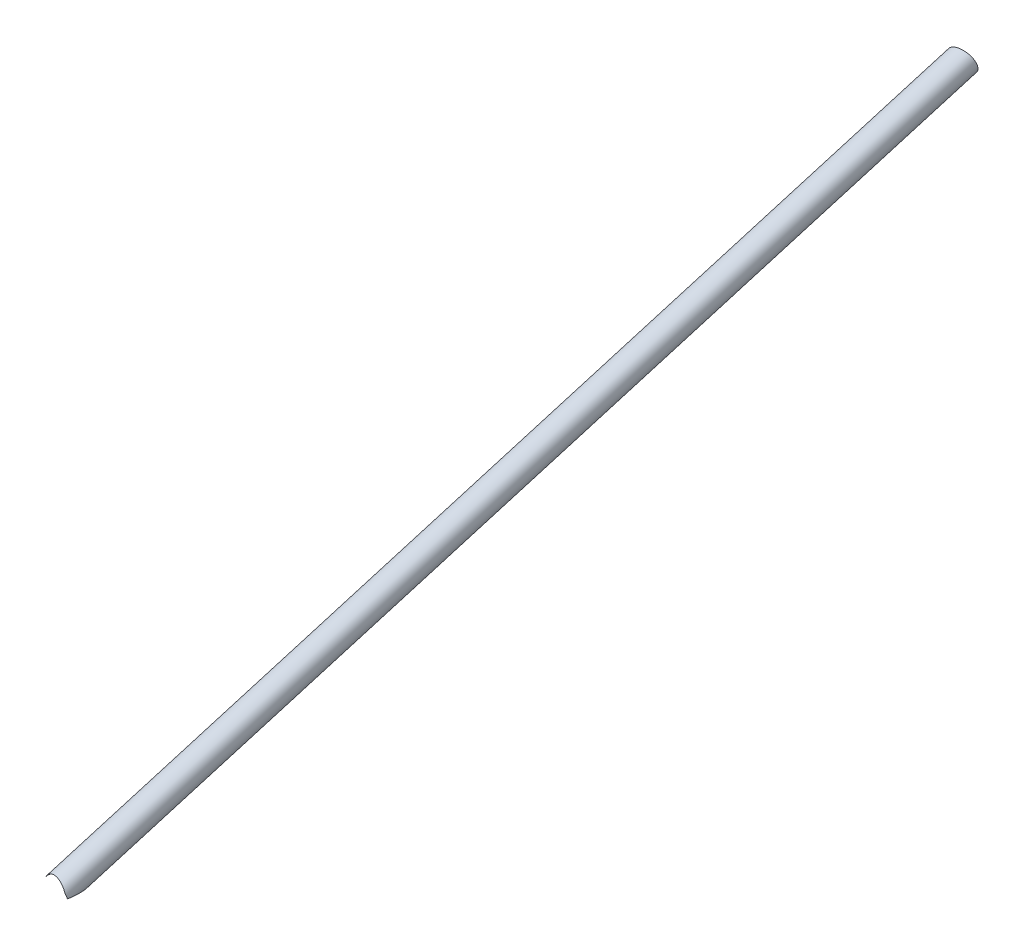
ISO-10303-21;
HEADER;
FILE_DESCRIPTION(('STEP AP214'),'2;1');
FILE_NAME('part.step','',(''),(''),'','','');
FILE_SCHEMA(('AUTOMOTIVE_DESIGN { 1 0 10303 214 1 1 1 1 }'));
ENDSEC;
DATA;
#1=APPLICATION_CONTEXT('core data for automotive mechanical design processes');
#2=APPLICATION_PROTOCOL_DEFINITION('international standard','automotive_design',2000,#1);
#3=PRODUCT_CONTEXT('',#1,'mechanical');
#4=PRODUCT('Part','Part','',(#3));
#5=PRODUCT_RELATED_PRODUCT_CATEGORY('part','',(#4));
#6=PRODUCT_DEFINITION_FORMATION('','',#4);
#7=PRODUCT_DEFINITION_CONTEXT('part definition',#1,'design');
#8=PRODUCT_DEFINITION('design','',#6,#7);
#9=PRODUCT_DEFINITION_SHAPE('','',#8);
#10=(LENGTH_UNIT() NAMED_UNIT(*) SI_UNIT(.MILLI.,.METRE.));
#11=(NAMED_UNIT(*) PLANE_ANGLE_UNIT() SI_UNIT($,.RADIAN.));
#12=(NAMED_UNIT(*) SI_UNIT($,.STERADIAN.) SOLID_ANGLE_UNIT());
#13=UNCERTAINTY_MEASURE_WITH_UNIT(LENGTH_MEASURE(1.E-05),#10,'distance_accuracy_value','');
#14=(GEOMETRIC_REPRESENTATION_CONTEXT(3) GLOBAL_UNCERTAINTY_ASSIGNED_CONTEXT((#13)) GLOBAL_UNIT_ASSIGNED_CONTEXT((#10,
#11,#12)) REPRESENTATION_CONTEXT('',''));
#15=CARTESIAN_POINT('',(0.,0.,0.));
#16=DIRECTION('',(0.,0.,1.));
#17=DIRECTION('',(1.,0.,0.));
#18=AXIS2_PLACEMENT_3D('',#15,#16,#17);
#19=CARTESIAN_POINT('',(-150.,500.,-1140.));
#20=DIRECTION('',(-0.0991899501072693,-0.396759800429077,0.912547540986877));
#21=DIRECTION('',(0.,-0.917070056253235,-0.39872611141445));
#22=AXIS2_PLACEMENT_3D('',#19,#20,#21);
#23=CYLINDRICAL_SURFACE('',#22,9.39999999999998);
#24=CARTESIAN_POINT('',(-148.870462108792,504.518151564833,-1150.39174859912));
#25=DIRECTION('',(-0.139628686010803,0.296710957772957,-0.944704418101425));
#26=DIRECTION('',(-0.904818702200995,-0.425797036329879,0.));
#27=AXIS2_PLACEMENT_3D('',#24,#25,#26);
#28=ELLIPSE('',#27,9.73124262715105,9.39999999999998);
#29=CARTESIAN_POINT('',(-157.675472433494,500.374617294385,-1150.39174859912));
#30=VERTEX_POINT('',#29);
#31=EDGE_CURVE('E107',#30,#30,#28,.T.);
#32=ORIENTED_EDGE('',*,*,#31,.T.);
#33=EDGE_LOOP('',(#32));
#34=FACE_BOUND('',#33,.T.);
#35=CARTESIAN_POINT('',(-220.064661909304,211.120893834007,-499.153135881706));
#36=CARTESIAN_POINT('',(-219.96082944293,210.969621935667,-498.805215018113));
#37=CARTESIAN_POINT('',(-219.861401801638,210.820763185261,-498.454922366743));
#38=CARTESIAN_POINT('',(-219.669911680091,210.527227931772,-497.750580735431));
#39=CARTESIAN_POINT('',(-219.577849788321,210.382551763444,-497.396531457907));
#40=CARTESIAN_POINT('',(-219.399998297891,210.096868440503,-496.685276886422));
#41=CARTESIAN_POINT('',(-219.314210423698,209.955862301437,-496.328070754785));
#42=CARTESIAN_POINT('',(-219.148102895325,209.67718888091,-495.61108945489));
#43=CARTESIAN_POINT('',(-219.067783407543,209.539521701131,-495.251314208823));
#44=CARTESIAN_POINT('',(-218.833831264763,209.130780783011,-494.167928817747));
#45=CARTESIAN_POINT('',(-218.687395291621,208.864277087637,-493.441034597602));
#46=CARTESIAN_POINT('',(-218.409746658629,208.341814271487,-491.980579186831));
#47=CARTESIAN_POINT('',(-218.278534884912,208.085855765058,-491.247017610804));
#48=CARTESIAN_POINT('',(-218.090597806271,207.70808932579,-490.139611325409));
#49=CARTESIAN_POINT('',(-218.029200520187,207.582697778848,-489.767769405641));
#50=CARTESIAN_POINT('',(-217.909320098101,207.334286459914,-489.022842792879));
#51=CARTESIAN_POINT('',(-217.850836844672,207.211266592472,-488.64975815061));
#52=CARTESIAN_POINT('',(-217.679369398335,206.845653363118,-487.528729783794));
#53=CARTESIAN_POINT('',(-217.570372973566,206.606517416624,-486.77904404042));
#54=CARTESIAN_POINT('',(-217.361488485521,206.137578015812,-485.276485617178));
#55=CARTESIAN_POINT('',(-217.261589948058,205.907764002921,-484.523617673646));
#56=CARTESIAN_POINT('',(-217.069418165177,205.457370898319,-483.014173744783));
#57=CARTESIAN_POINT('',(-216.977144764104,205.236791618142,-482.257597835478));
#58=CARTESIAN_POINT('',(-216.799277112594,204.805976416339,-480.742807782751));
#59=CARTESIAN_POINT('',(-216.713666653823,204.595715885413,-479.984602539675));
#60=CARTESIAN_POINT('',(-216.547803817039,204.185962661731,-478.464665763676));
#61=CARTESIAN_POINT('',(-216.467551659211,203.986470411532,-477.702934087217));
#62=CARTESIAN_POINT('',(-216.311204365483,203.59947616567,-476.174142492695));
#63=CARTESIAN_POINT('',(-216.23511907925,203.412002414979,-475.407074404776));
#64=CARTESIAN_POINT('',(-216.08625772242,203.052107572373,-473.869163351397));
#65=CARTESIAN_POINT('',(-216.013481243603,202.879684621156,-473.098320864666));
#66=CARTESIAN_POINT('',(-215.906275037471,202.636082414801,-471.94224410546));
#67=CARTESIAN_POINT('',(-215.871016693918,202.557698891732,-471.558601039787));
#68=CARTESIAN_POINT('',(-215.80090012685,202.406338728497,-470.790216100798));
#69=CARTESIAN_POINT('',(-215.766041895608,202.333361983764,-470.405474248882));
#70=CARTESIAN_POINT('',(-215.696567630002,202.193640266377,-469.634604845763));
#71=CARTESIAN_POINT('',(-215.661951745579,202.126898882143,-469.248476627826));
#72=CARTESIAN_POINT('',(-215.592852834671,202.000815895249,-468.475001967521));
#73=CARTESIAN_POINT('',(-215.558369805454,201.941474139647,-468.087655550501));
#74=CARTESIAN_POINT('',(-215.489556145688,201.83183594197,-467.313134358168));
#75=CARTESIAN_POINT('',(-215.455225423748,201.781506810131,-466.92596426136));
#76=CARTESIAN_POINT('',(-215.386527089375,201.691481572309,-466.150331966893));
#77=CARTESIAN_POINT('',(-215.352159473597,201.651786529688,-465.761869643947));
#78=CARTESIAN_POINT('',(-215.283471034226,201.585521423804,-464.984213376193));
#79=CARTESIAN_POINT('',(-215.249150199317,201.558937662302,-464.595020623218));
#80=CARTESIAN_POINT('',(-215.180753355595,201.522055493106,-463.815876889823));
#81=CARTESIAN_POINT('',(-215.146677277403,201.511752273121,-463.425926167585));
#82=CARTESIAN_POINT('',(-215.098531912781,201.5117193361,-462.867928637116));
#83=CARTESIAN_POINT('',(-215.084113886297,201.513617842544,-462.699900294433));
#84=CARTESIAN_POINT('',(-215.055523394219,201.521656339396,-462.363913865341));
#85=CARTESIAN_POINT('',(-215.041350935864,201.527796454637,-462.195955781145));
#86=CARTESIAN_POINT('',(-215.013355299397,201.544775158173,-461.860176782189));
#87=CARTESIAN_POINT('',(-214.999532256242,201.555615533396,-461.69235594394));
#88=CARTESIAN_POINT('',(-214.97239236311,201.582500784651,-461.357093030097));
#89=CARTESIAN_POINT('',(-214.959075519862,201.598545729831,-461.189650959564));
#90=CARTESIAN_POINT('',(-214.920247873764,201.655160005968,-460.689403575298));
#91=CARTESIAN_POINT('',(-214.895752535553,201.704264549474,-460.35741662395));
#92=CARTESIAN_POINT('',(-214.85166850565,201.829970240812,-459.698362111302));
#93=CARTESIAN_POINT('',(-214.832076983314,201.906555463473,-459.371291814917));
#94=CARTESIAN_POINT('',(-214.8063351988,202.060956921665,-458.833103321834));
#95=CARTESIAN_POINT('',(-214.797881838283,202.129916155263,-458.619553196466));
#96=CARTESIAN_POINT('',(-214.786037918811,202.283104182157,-458.197885308637));
#97=CARTESIAN_POINT('',(-214.782645581866,202.367327601314,-457.989765663649));
#98=CARTESIAN_POINT('',(-214.782473132653,202.551531145224,-457.580679324623));
#99=CARTESIAN_POINT('',(-214.785690334293,202.651504853875,-457.379709758588));
#100=CARTESIAN_POINT('',(-214.800414711216,202.867013483819,-456.98657955664));
#101=CARTESIAN_POINT('',(-214.811921853037,202.982548342299,-456.794418885174));
#102=CARTESIAN_POINT('',(-214.844973381277,203.228810776946,-456.419450359774));
#103=CARTESIAN_POINT('',(-214.866573056302,203.359619024577,-456.236700259236));
#104=CARTESIAN_POINT('',(-214.921321595915,203.634062287765,-455.882930575646));
#105=CARTESIAN_POINT('',(-214.954470818859,203.777697701219,-455.711911356774));
#106=CARTESIAN_POINT('',(-215.033522426805,204.075491779698,-455.382215877625));
#107=CARTESIAN_POINT('',(-215.079434630329,204.229658477261,-455.223549240926));
#108=CARTESIAN_POINT('',(-215.184808308445,204.545723095889,-454.918946999038));
#109=CARTESIAN_POINT('',(-215.244269776858,204.707621013427,-454.77301138804));
#110=CARTESIAN_POINT('',(-215.372727424687,205.025406616735,-454.503091359236));
#111=CARTESIAN_POINT('',(-215.440818246386,205.180970578113,-454.378291369967));
#112=CARTESIAN_POINT('',(-215.589290308086,205.494366437123,-454.139343111471));
#113=CARTESIAN_POINT('',(-215.669670759541,205.652198188657,-454.025194159592));
#114=CARTESIAN_POINT('',(-215.842659990219,205.968240404357,-453.807128739071));
#115=CARTESIAN_POINT('',(-215.935269902983,206.126450902291,-453.703213220519));
#116=CARTESIAN_POINT('',(-216.132490399664,206.441531478268,-453.505195921966));
#117=CARTESIAN_POINT('',(-216.237101866339,206.598401456798,-453.411094864827));
#118=CARTESIAN_POINT('',(-216.470200096123,206.926472469926,-453.222421153415));
#119=CARTESIAN_POINT('',(-216.600047809247,207.097339978768,-453.128947069423));
#120=CARTESIAN_POINT('',(-216.87350754597,207.433712190717,-452.953148374518));
#121=CARTESIAN_POINT('',(-217.017120350925,207.59921658868,-452.870824397167));
#122=CARTESIAN_POINT('',(-217.317417876782,207.923325354883,-452.716942213368));
#123=CARTESIAN_POINT('',(-217.474106574103,208.081927601684,-452.645387300506));
#124=CARTESIAN_POINT('',(-217.799679362889,208.390807238189,-452.512822737132));
#125=CARTESIAN_POINT('',(-217.968563983405,208.541084266251,-452.451813544475));
#126=CARTESIAN_POINT('',(-218.330908069247,208.843223449085,-452.335948629291));
#127=CARTESIAN_POINT('',(-218.525259495738,208.994333384765,-452.281916359932));
#128=CARTESIAN_POINT('',(-218.925742226971,209.28427844637,-452.185879661577));
#129=CARTESIAN_POINT('',(-219.131874148643,209.423112928472,-452.143875863191));
#130=CARTESIAN_POINT('',(-219.554565433792,209.687483422111,-452.072007123649));
#131=CARTESIAN_POINT('',(-219.771126335479,209.813017463122,-452.042143979337));
#132=CARTESIAN_POINT('',(-220.21316027322,210.04993265257,-451.994819885171));
#133=CARTESIAN_POINT('',(-220.438633307832,210.161313803296,-451.97735893331));
#134=CARTESIAN_POINT('',(-220.901514066555,210.371398508351,-451.95501111472));
#135=CARTESIAN_POINT('',(-221.13907059339,210.469802191143,-451.950384082324));
#136=CARTESIAN_POINT('',(-221.620001292311,210.650820858827,-451.955020999209));
#137=CARTESIAN_POINT('',(-221.863375598401,210.733435479648,-451.964285268759));
#138=CARTESIAN_POINT('',(-222.354072929677,210.882735813747,-451.997448459337));
#139=CARTESIAN_POINT('',(-222.601397175277,210.949416498206,-452.021351992121));
#140=CARTESIAN_POINT('',(-223.097817269138,211.066938953308,-452.084703742165));
#141=CARTESIAN_POINT('',(-223.346913086137,211.117781002739,-452.124151685789));
#142=CARTESIAN_POINT('',(-223.841468757699,211.203539070544,-452.219059028102));
#143=CARTESIAN_POINT('',(-224.086934982219,211.238647110345,-452.2743110871));
#144=CARTESIAN_POINT('',(-224.574974156324,211.294667198745,-452.402166537644));
#145=CARTESIAN_POINT('',(-224.817547076714,211.315579104223,-452.474770104114));
#146=CARTESIAN_POINT('',(-225.296940480878,211.344419588381,-452.638455733445));
#147=CARTESIAN_POINT('',(-225.533766048249,211.352360085893,-452.729520746327));
#148=CARTESIAN_POINT('',(-225.999026922723,211.356995961471,-452.931279548466));
#149=CARTESIAN_POINT('',(-226.227463152901,211.353692580464,-453.04197117036));
#150=CARTESIAN_POINT('',(-226.656528967507,211.338630678069,-453.274859106098));
#151=CARTESIAN_POINT('',(-226.857967196533,211.327513106787,-453.395606706798));
#152=CARTESIAN_POINT('',(-227.248711450583,211.29963427726,-453.654788760885));
#153=CARTESIAN_POINT('',(-227.438018629829,211.282873556892,-453.793221527836));
#154=CARTESIAN_POINT('',(-227.802226836458,211.246041019215,-454.087171149494));
#155=CARTESIAN_POINT('',(-227.97714135759,211.22597235752,-454.242671675619));
#156=CARTESIAN_POINT('',(-228.311174131773,211.184836785461,-454.56966357416));
#157=CARTESIAN_POINT('',(-228.470293108817,211.163769920916,-454.741154212964));
#158=CARTESIAN_POINT('',(-228.755773682123,211.124918373328,-455.079150815596));
#159=CARTESIAN_POINT('',(-228.883818693126,211.107023568657,-455.244229921784));
#160=CARTESIAN_POINT('',(-229.126632302646,211.073291416692,-455.584032898464));
#161=CARTESIAN_POINT('',(-229.2414020102,211.057453897515,-455.758755961483));
#162=CARTESIAN_POINT('',(-229.458153580452,211.028688813224,-456.116209768541));
#163=CARTESIAN_POINT('',(-229.560132371399,211.015761946516,-456.298942421926));
#164=CARTESIAN_POINT('',(-229.752107296455,210.993344127014,-456.670796999958));
#165=CARTESIAN_POINT('',(-229.842101961881,210.983853595107,-456.859919704167));
#166=CARTESIAN_POINT('',(-230.004086817619,210.969186004325,-457.22714269366));
#167=CARTESIAN_POINT('',(-230.076952406773,210.963715405951,-457.404848237641));
#168=CARTESIAN_POINT('',(-230.214355540076,210.955885207276,-457.763540248354));
#169=CARTESIAN_POINT('',(-230.278891514365,210.953526192638,-457.94452732624));
#170=CARTESIAN_POINT('',(-230.400519853747,210.951840745065,-458.30911791177));
#171=CARTESIAN_POINT('',(-230.457607222133,210.952516337164,-458.492723085033));
#172=CARTESIAN_POINT('',(-230.565109870684,210.956756584407,-458.86184658256));
#173=CARTESIAN_POINT('',(-230.61552464359,210.96032145905,-459.047365051118));
#174=CARTESIAN_POINT('',(-230.710659132725,210.970178375721,-459.420744973122));
#175=CARTESIAN_POINT('',(-230.755349703929,210.976483707799,-459.608613455332));
#176=CARTESIAN_POINT('',(-230.839426098102,210.991617487848,-459.985427223775));
#177=CARTESIAN_POINT('',(-230.878811860188,211.000445964773,-460.17437252234));
#178=CARTESIAN_POINT('',(-230.952862535212,211.020411198731,-460.552967142491));
#179=CARTESIAN_POINT('',(-230.987529651388,211.031546872314,-460.742616092739));
#180=CARTESIAN_POINT('',(-231.052684446004,211.055925048351,-461.122484467732));
#181=CARTESIAN_POINT('',(-231.083172222995,211.06916750111,-461.312703878919));
#182=CARTESIAN_POINT('',(-231.16971035645,211.112078882961,-461.88823599223));
#183=CARTESIAN_POINT('',(-231.220030892352,211.144701019008,-462.274196079419));
#184=CARTESIAN_POINT('',(-231.308552457758,211.216328616948,-463.046937534212));
#185=CARTESIAN_POINT('',(-231.346751054926,211.255335357571,-463.433719050985));
#186=CARTESIAN_POINT('',(-231.413284094541,211.338564268604,-464.207815733878));
#187=CARTESIAN_POINT('',(-231.441611952809,211.382789893994,-464.595131083845));
#188=CARTESIAN_POINT('',(-231.490059798372,211.475455257765,-465.36977438217));
#189=CARTESIAN_POINT('',(-231.51017940152,211.523895193247,-465.75710233027));
#190=CARTESIAN_POINT('',(-231.543529201832,211.624311270585,-466.532603993837));
#191=CARTESIAN_POINT('',(-231.556741535322,211.676296192308,-466.920777320564));
#192=CARTESIAN_POINT('',(-231.577169464479,211.783029671613,-467.696899741673));
#193=CARTESIAN_POINT('',(-231.584384975849,211.837778268032,-468.084848832827));
#194=CARTESIAN_POINT('',(-231.598204131026,212.005275667185,-469.248001020696));
#195=CARTESIAN_POINT('',(-231.596992650752,212.121318012426,-470.022825511087));
#196=CARTESIAN_POINT('',(-231.577842536066,212.359132896026,-471.573663616341));
#197=CARTESIAN_POINT('',(-231.559854913132,212.480921224124,-472.349674065882));
#198=CARTESIAN_POINT('',(-231.509526872012,212.727482718987,-473.900813643268));
#199=CARTESIAN_POINT('',(-231.47718523022,212.852256139358,-474.67594269033));
#200=CARTESIAN_POINT('',(-231.399665835817,213.10270033768,-476.224181012791));
#201=CARTESIAN_POINT('',(-231.354507863806,213.228369444098,-476.997291562134));
#202=CARTESIAN_POINT('',(-231.252092819072,213.479267176833,-478.542756473975));
#203=CARTESIAN_POINT('',(-231.194836137048,213.604495817242,-479.315110860082));
#204=CARTESIAN_POINT('',(-231.081746006772,213.827032566615,-480.696750454011));
#205=CARTESIAN_POINT('',(-231.028146189664,213.924673227689,-481.306165911172));
#206=CARTESIAN_POINT('',(-230.913463395117,214.118235675262,-482.524565702473));
#207=CARTESIAN_POINT('',(-230.852380441967,214.214157467339,-483.133550038007));
#208=CARTESIAN_POINT('',(-230.722457894004,214.403709893967,-484.351378283394));
#209=CARTESIAN_POINT('',(-230.653614273724,214.497339308526,-484.960221954697));
#210=CARTESIAN_POINT('',(-230.507779288278,214.681597078576,-486.177387457783));
#211=CARTESIAN_POINT('',(-230.43078796695,214.772225450209,-486.785709292354));
#212=CARTESIAN_POINT('',(-230.268100322393,214.949682727632,-488.001268803383));
#213=CARTESIAN_POINT('',(-230.182410642822,215.036514461772,-488.608506952132));
#214=CARTESIAN_POINT('',(-230.001410899387,215.205596149337,-489.822184310026));
#215=CARTESIAN_POINT('',(-229.906100985831,215.287846174315,-490.428623531504));
#216=CARTESIAN_POINT('',(-229.704708297289,215.44668008617,-491.640160451869));
#217=CARTESIAN_POINT('',(-229.598630776111,215.523266705144,-492.2452586592));
#218=CARTESIAN_POINT('',(-229.373997607431,215.669457221611,-493.453953686459));
#219=CARTESIAN_POINT('',(-229.255442758708,215.73906156554,-494.05755059997));
#220=CARTESIAN_POINT('',(-229.002912746137,215.869765890845,-495.265390643486));
#221=CARTESIAN_POINT('',(-228.868869897929,215.930825751481,-495.869624225817));
#222=CARTESIAN_POINT('',(-228.65380281249,216.013703305415,-496.773661860216));
#223=CARTESIAN_POINT('',(-228.579751001399,216.039884917691,-497.074729500678));
#224=CARTESIAN_POINT('',(-228.426338899028,216.088843955923,-497.675788301148));
#225=CARTESIAN_POINT('',(-228.346978733754,216.111621462643,-497.975779486529));
#226=CARTESIAN_POINT('',(-228.182321810574,216.153126520624,-498.573753582403));
#227=CARTESIAN_POINT('',(-228.09703756198,216.171862282228,-498.871739349864));
#228=CARTESIAN_POINT('',(-227.919350813822,216.204546445273,-499.465841371497));
#229=CARTESIAN_POINT('',(-227.826948787167,216.218495164434,-499.76195774846));
#230=CARTESIAN_POINT('',(-227.633725957743,216.240511936213,-500.351318405693));
#231=CARTESIAN_POINT('',(-227.532914305004,216.24858628972,-500.644565429467));
#232=CARTESIAN_POINT('',(-227.320889721704,216.257365711324,-501.227352842718));
#233=CARTESIAN_POINT('',(-227.209680156181,216.258073155274,-501.516894397133));
#234=CARTESIAN_POINT('',(-227.021786093278,216.251501913253,-501.974177506649));
#235=CARTESIAN_POINT('',(-226.949378225248,216.247343989376,-502.143719206751));
#236=CARTESIAN_POINT('',(-226.799023665284,216.234915663983,-502.48024857086));
#237=CARTESIAN_POINT('',(-226.721075637135,216.226644267445,-502.647235606834));
#238=CARTESIAN_POINT('',(-226.55873793521,216.205098104257,-502.977408200065));
#239=CARTESIAN_POINT('',(-226.474359123204,216.191831631337,-503.140599585251));
#240=CARTESIAN_POINT('',(-226.297697552239,216.159051460111,-503.461955649908));
#241=CARTESIAN_POINT('',(-226.205419008421,216.139541078399,-503.620122949118));
#242=CARTESIAN_POINT('',(-226.00883692892,216.091978128795,-503.932802696494));
#243=CARTESIAN_POINT('',(-225.904303668266,216.063737475759,-504.087144632717));
#244=CARTESIAN_POINT('',(-225.682417446888,215.996186346344,-504.384095016771));
#245=CARTESIAN_POINT('',(-225.565066724586,215.956877800958,-504.52670550576));
#246=CARTESIAN_POINT('',(-225.345122602532,215.874813680748,-504.760272189955));
#247=CARTESIAN_POINT('',(-225.245832251777,215.835195311278,-504.855376142478));
#248=CARTESIAN_POINT('',(-225.037643833457,215.745646797275,-505.02880037414));
#249=CARTESIAN_POINT('',(-224.928768810851,215.695741019269,-505.107159437515));
#250=CARTESIAN_POINT('',(-224.730796506436,215.598405291063,-505.223246503769));
#251=CARTESIAN_POINT('',(-224.643582554952,215.553490451215,-505.26623576014));
#252=CARTESIAN_POINT('',(-224.466001659471,215.457495814896,-505.33559051179));
#253=CARTESIAN_POINT('',(-224.375638539711,215.406423322507,-505.361975476019));
#254=CARTESIAN_POINT('',(-224.194081325292,215.299140858272,-505.396308621963));
#255=CARTESIAN_POINT('',(-224.102885601366,215.242916736398,-505.404204339614));
#256=CARTESIAN_POINT('',(-223.922740701179,215.127336720177,-505.401723625866));
#257=CARTESIAN_POINT('',(-223.833793873258,215.067977737113,-505.391328834648));
#258=CARTESIAN_POINT('',(-223.636284836043,214.931456152404,-505.349372735922));
#259=CARTESIAN_POINT('',(-223.529093281393,214.853905992966,-505.312756658478));
#260=CARTESIAN_POINT('',(-223.323380879237,214.699363570495,-505.219572105393));
#261=CARTESIAN_POINT('',(-223.224879570695,214.622372904731,-505.162960031638));
#262=CARTESIAN_POINT('',(-223.048550923109,214.480049817827,-505.043541444323));
#263=CARTESIAN_POINT('',(-222.969694985342,214.41449326763,-504.98247249838));
#264=CARTESIAN_POINT('',(-222.817721639294,214.284971247408,-504.851986969071));
#265=CARTESIAN_POINT('',(-222.744609069755,214.22100714935,-504.782563469118));
#266=CARTESIAN_POINT('',(-222.603282868381,214.09458539652,-504.637164487529));
#267=CARTESIAN_POINT('',(-222.535083498436,214.032132451313,-504.561171237531));
#268=CARTESIAN_POINT('',(-222.403164754542,213.908868096844,-504.404236072563));
#269=CARTESIAN_POINT('',(-222.339443787334,213.84805610858,-504.323295936878));
#270=CARTESIAN_POINT('',(-222.181460702735,213.694493253794,-504.111317944994));
#271=CARTESIAN_POINT('',(-222.089940695972,213.602805272281,-503.97747156888));
#272=CARTESIAN_POINT('',(-221.914460130959,213.422574385448,-503.702838441379));
#273=CARTESIAN_POINT('',(-221.830503836617,213.334033270936,-503.562047843659));
#274=CARTESIAN_POINT('',(-221.668727648922,213.159562404089,-503.275006997695));
#275=CARTESIAN_POINT('',(-221.590919211823,213.07363770223,-503.128747271634));
#276=CARTESIAN_POINT('',(-221.440596147471,212.904209899963,-502.832147271306));
#277=CARTESIAN_POINT('',(-221.368082452104,212.820707227389,-502.681806285084));
#278=CARTESIAN_POINT('',(-221.156888424361,212.572932056917,-502.225104415136));
#279=CARTESIAN_POINT('',(-221.024990914873,212.411869049077,-501.913864509677));
#280=CARTESIAN_POINT('',(-220.774956157746,212.096725931094,-501.283027945664));
#281=CARTESIAN_POINT('',(-220.656805228238,211.942638972711,-500.963439990706));
#282=CARTESIAN_POINT('',(-220.458414218969,211.676482973967,-500.395619205697));
#283=CARTESIAN_POINT('',(-220.375895017725,211.563228783599,-500.148730349718));
#284=CARTESIAN_POINT('',(-220.256208565787,211.395630363212,-499.776512431228));
#285=CARTESIAN_POINT('',(-220.217046473084,211.340219743243,-499.652298722742));
#286=CARTESIAN_POINT('',(-220.139953509164,211.230066577191,-499.403204301104));
#287=CARTESIAN_POINT('',(-220.102022567123,211.175323992791,-499.278323626803));
#288=CARTESIAN_POINT('',(-220.064661909304,211.120893834007,-499.153135881706));
#289=B_SPLINE_CURVE_WITH_KNOTS('',3,(#35,#36,#37,#38,#39,#40,#41,#42,#43,#44,#45,#46,#47,#48,
#49,#50,#51,#52,#53,#54,#55,#56,#57,#58,#59,#60,#61,#62,#63,#64,#65,#66,#67,#68,#69,#70,#71,#72,
#73,#74,#75,#76,#77,#78,#79,#80,#81,#82,#83,#84,#85,#86,#87,#88,#89,#90,#91,#92,#93,#94,#95,#96,
#97,#98,#99,#100,#101,#102,#103,#104,#105,#106,#107,#108,#109,#110,#111,#112,#113,#114,#115,
#116,#117,#118,#119,#120,#121,#122,#123,#124,#125,#126,#127,#128,#129,#130,#131,#132,#133,#134,
#135,#136,#137,#138,#139,#140,#141,#142,#143,#144,#145,#146,#147,#148,#149,#150,#151,#152,#153,
#154,#155,#156,#157,#158,#159,#160,#161,#162,#163,#164,#165,#166,#167,#168,#169,#170,#171,#172,
#173,#174,#175,#176,#177,#178,#179,#180,#181,#182,#183,#184,#185,#186,#187,#188,#189,#190,#191,
#192,#193,#194,#195,#196,#197,#198,#199,#200,#201,#202,#203,#204,#205,#206,#207,#208,#209,#210,
#211,#212,#213,#214,#215,#216,#217,#218,#219,#220,#221,#222,#223,#224,#225,#226,#227,#228,#229,
#230,#231,#232,#233,#234,#235,#236,#237,#238,#239,#240,#241,#242,#243,#244,#245,#246,#247,#248,
#249,#250,#251,#252,#253,#254,#255,#256,#257,#258,#259,#260,#261,#262,#263,#264,#265,#266,#267,
#268,#269,#270,#271,#272,#273,#274,#275,#276,#277,#278,#279,#280,#281,#282,#283,#284,#285,#286,
#287,#288),.UNSPECIFIED.,.T.,.F.,(4,2,2,2,2,2,2,2,2,2,2,2,2,2,2,2,2,2,2,2,2,2,2,2,2,2,2,2,2,2,2,
2,2,2,2,2,2,2,2,2,2,2,2,2,2,2,2,2,2,2,2,2,2,2,2,2,2,2,2,2,2,2,2,2,2,2,2,2,2,2,2,2,2,2,2,2,2,2,2,
2,2,2,2,2,2,2,2,2,2,2,2,2,2,2,2,2,2,2,2,2,2,2,2,2,2,2,2,2,2,2,2,2,2,2,2,2,2,2,2,2,2,2,2,2,2,2,
4),(0.,1.17999676196415,2.36008770559703,3.54050179757393,4.72095179256761,7.0844199034725,
9.44802551234497,10.6395752572721,11.8310769470994,14.2141843543517,16.5945125137533,
18.9747920706909,21.3490875532907,23.723480541172,26.1032632414396,28.4827515380335,
29.6621792941726,30.841584234464,32.0216637891054,33.2017189488368,34.3774031748412,
35.5532049202864,36.7277756103599,37.9019990494803,38.4079255487566,38.9138669384228,
39.4200008440156,39.9261414743267,40.9346312963165,41.9425376354637,42.6156879664457,
43.2886017567895,43.9612421316916,44.6338797915424,45.3102462697242,45.9866337358932,
46.6635429917272,47.3404519388079,47.9720230882922,48.6035537309444,49.235142950895,
49.8667786563814,50.5682624315353,51.2697860490298,51.9715237848007,52.6732919796917,
53.4285491043412,54.1838458171761,54.9392542749031,55.6946626104184,56.4652569763174,
57.2358691087694,58.0067241294021,58.7775655808793,59.5387246852617,60.299891463359,
61.0603584460532,61.8207415027362,62.5250959509945,63.2293832828771,63.9330026070167,
64.6365896656479,65.2649634619175,65.8932847250054,66.5217565922776,67.1503054095459,
67.726477486138,68.3027579942914,68.8794231194394,69.4561320581007,70.0356695529358,
70.6152136983342,71.1944863066637,71.773745252914,72.9451767202774,74.1168430935764,
75.2892895257778,76.4617908222295,77.637309641098,78.8128449839498,81.1629576327393,
83.5199544757241,85.8771522791856,88.2307316080343,90.5842349454595,92.4427240342277,
94.3012070905729,96.1606586190659,98.0201001440332,99.8781319955315,101.73613482117,
103.593235395148,105.450217152755,107.315645109615,108.249026702109,109.182386146282,
110.1138313408,111.0452147027,111.975597577097,112.905680390506,113.458776284969,
114.012006034731,114.564321234233,115.116343544541,115.681202245955,116.245962458599,
116.674026611228,117.101088276575,117.421100778446,117.740737355025,118.061279821371,
118.382144228412,118.791663833441,119.20208189983,119.559627035412,119.917470239359,
120.276313493817,120.635028431422,121.193407054589,121.752098509375,122.311807641857,
122.871615048141,123.994307654868,125.115873118023,125.967432259329,126.392039297162,
126.816621865526),.UNSPECIFIED.);
#290=CARTESIAN_POINT('',(-214.860041456087,203.313279484268,-456.305286136041));
#291=VERTEX_POINT('',#290);
#292=CARTESIAN_POINT('',(-215.191128345141,201.52898822881,-463.933703285774));
#293=VERTEX_POINT('',#292);
#294=EDGE_CURVE('E98',#291,#293,#289,.T.);
#295=ORIENTED_EDGE('',*,*,#294,.T.);
#296=CARTESIAN_POINT('',(-222.869770330287,199.900460150074,-473.346138408661));
#297=CARTESIAN_POINT('',(-222.723274419667,199.910314908707,-473.368801561078));
#298=CARTESIAN_POINT('',(-222.575746711598,199.920854301924,-473.384806179458));
#299=CARTESIAN_POINT('',(-222.279857605703,199.943274310734,-473.402518194048));
#300=CARTESIAN_POINT('',(-222.131495831682,199.955155587004,-473.40421851616));
#301=CARTESIAN_POINT('',(-221.835333132637,199.98018945457,-473.392719859452));
#302=CARTESIAN_POINT('',(-221.687532683645,199.993342947451,-473.3795102426));
#303=CARTESIAN_POINT('',(-221.394177189296,200.020789600429,-473.338091457522));
#304=CARTESIAN_POINT('',(-221.248621837304,200.035082603219,-473.309884356653));
#305=CARTESIAN_POINT('',(-220.961616426003,200.064611604695,-473.239021737341));
#306=CARTESIAN_POINT('',(-220.820156056001,200.079844864288,-473.196406704956));
#307=CARTESIAN_POINT('',(-220.542160099187,200.11111808909,-473.097621106224));
#308=CARTESIAN_POINT('',(-220.405624781143,200.12715809821,-473.041449801375));
#309=CARTESIAN_POINT('',(-220.138299491376,200.159888321977,-472.91672999378));
#310=CARTESIAN_POINT('',(-220.007514086216,200.176579034247,-472.848171866613));
#311=CARTESIAN_POINT('',(-219.752340755759,200.21045048476,-472.700092069059));
#312=CARTESIAN_POINT('',(-219.627956821713,200.227631518582,-472.620563669859));
#313=CARTESIAN_POINT('',(-219.199740295672,200.28906178499,-472.322231523699));
#314=CARTESIAN_POINT('',(-218.913930290361,200.334327604905,-472.077234101355));
#315=CARTESIAN_POINT('',(-218.51724923921,200.402867650238,-471.679238627067));
#316=CARTESIAN_POINT('',(-218.390219763538,200.425850935771,-471.541294802826));
#317=CARTESIAN_POINT('',(-218.146022228709,200.471990150052,-471.25694372405));
#318=CARTESIAN_POINT('',(-218.028851826498,200.495146036349,-471.110538494439));
#319=CARTESIAN_POINT('',(-217.721023073293,200.558641056509,-470.700797617713));
#320=CARTESIAN_POINT('',(-217.539595882608,200.599109632844,-470.430556563324));
#321=CARTESIAN_POINT('',(-217.20077706992,200.680415279292,-469.875417114582));
#322=CARTESIAN_POINT('',(-217.043404155085,200.721252610311,-469.590507540302));
#323=CARTESIAN_POINT('',(-216.749292902238,200.80350656296,-469.009482035807));
#324=CARTESIAN_POINT('',(-216.61260754596,200.844924384776,-468.713339682517));
#325=CARTESIAN_POINT('',(-216.35768003287,200.928472348117,-468.113256074709));
#326=CARTESIAN_POINT('',(-216.239444875297,200.970602753281,-467.80931191118));
#327=CARTESIAN_POINT('',(-216.019800145127,201.055680494381,-467.196964008496));
#328=CARTESIAN_POINT('',(-215.918324681065,201.098623853515,-466.888583179761));
#329=CARTESIAN_POINT('',(-215.729964077909,201.185839555904,-466.267653930166));
#330=CARTESIAN_POINT('',(-215.643077109014,201.230111731666,-465.955106037286));
#331=CARTESIAN_POINT('',(-215.482463431787,201.320470145432,-465.326542538655));
#332=CARTESIAN_POINT('',(-215.40875166081,201.366558371059,-465.010523422722));
#333=CARTESIAN_POINT('',(-215.273570082815,201.461028167897,-464.376223968351));
#334=CARTESIAN_POINT('',(-215.212100488986,201.509409779029,-464.057943590636));
#335=CARTESIAN_POINT('',(-215.100628351548,201.609106537617,-463.419906526328));
#336=CARTESIAN_POINT('',(-215.050623704738,201.660421144867,-463.100150121504));
#337=CARTESIAN_POINT('',(-214.961507261222,201.766810589414,-462.45973763111));
#338=CARTESIAN_POINT('',(-214.922395801311,201.821885542909,-462.139081518033));
#339=CARTESIAN_POINT('',(-214.854761959145,201.93679255473,-461.497778852659));
#340=CARTESIAN_POINT('',(-214.826230860697,201.996620647817,-461.177132511059));
#341=CARTESIAN_POINT('',(-214.779622277033,202.122421093807,-460.536313118451));
#342=CARTESIAN_POINT('',(-214.761543497414,202.188392684732,-460.21614001374));
#343=CARTESIAN_POINT('',(-214.737457003306,202.320483874981,-459.612719314425));
#344=CARTESIAN_POINT('',(-214.730328260251,202.385767046085,-459.32933441753));
#345=CARTESIAN_POINT('',(-214.724864985732,202.524270133413,-458.7643738327));
#346=CARTESIAN_POINT('',(-214.726531128667,202.597490657857,-458.482798285164));
#347=CARTESIAN_POINT('',(-214.739351714268,202.753944716743,-457.922854799794));
#348=CARTESIAN_POINT('',(-214.750498983028,202.837170639715,-457.644484597997));
#349=CARTESIAN_POINT('',(-214.783389199169,203.016413269562,-457.092509046732));
#350=CARTESIAN_POINT('',(-214.80512917935,203.112426389053,-456.818902385132));
#351=CARTESIAN_POINT('',(-214.852795754249,203.290374015835,-456.357671067665));
#352=CARTESIAN_POINT('',(-214.875665656455,203.368281304817,-456.168183733312));
#353=CARTESIAN_POINT('',(-214.928424190418,203.533644709543,-455.79435614893));
#354=CARTESIAN_POINT('',(-214.958313129914,203.62110124387,-455.610016124974));
#355=CARTESIAN_POINT('',(-215.026027209498,203.806712633013,-455.248792687962));
#356=CARTESIAN_POINT('',(-215.063834169316,203.904842736755,-455.071893289198));
#357=CARTESIAN_POINT('',(-215.148544101625,204.113066296001,-454.727544256859));
#358=CARTESIAN_POINT('',(-215.195443712941,204.223155324198,-454.560091160817));
#359=CARTESIAN_POINT('',(-215.288065548539,204.430294029415,-454.272734338884));
#360=CARTESIAN_POINT('',(-215.331798727619,204.524923811854,-454.150445244604));
#361=CARTESIAN_POINT('',(-215.425941096801,204.721541830417,-453.91468558463));
#362=CARTESIAN_POINT('',(-215.476348553043,204.823528152323,-453.801212740739));
#363=CARTESIAN_POINT('',(-215.584121076629,205.034142883264,-453.58432109831));
#364=CARTESIAN_POINT('',(-215.641481370232,205.142766709936,-453.480895488362));
#365=CARTESIAN_POINT('',(-215.763319340783,205.365624887234,-453.284835691848));
#366=CARTESIAN_POINT('',(-215.827797275177,205.479859440716,-453.192201895874));
#367=CARTESIAN_POINT('',(-215.963659044966,205.712251887287,-453.018285439597));
#368=CARTESIAN_POINT('',(-216.035026419332,205.830400006312,-452.936976803386));
#369=CARTESIAN_POINT('',(-216.184603795683,206.069341344674,-452.78531510264));
#370=CARTESIAN_POINT('',(-216.26281387716,206.190134594725,-452.714962165401));
#371=CARTESIAN_POINT('',(-216.425948877539,206.433084040392,-452.584562400508));
#372=CARTESIAN_POINT('',(-216.510885211192,206.555242237095,-452.524533665631));
#373=CARTESIAN_POINT('',(-216.687066420736,206.799385875789,-452.414123553475));
#374=CARTESIAN_POINT('',(-216.778312995883,206.921371262149,-452.363744788668));
#375=CARTESIAN_POINT('',(-217.008884797376,207.218132637047,-452.251191090904));
#376=CARTESIAN_POINT('',(-217.15149567294,207.392176576244,-452.193783196824));
#377=CARTESIAN_POINT('',(-217.448458962756,207.734587743566,-452.094445430695));
#378=CARTESIAN_POINT('',(-217.602816177763,207.902952609628,-452.05252192857));
#379=CARTESIAN_POINT('',(-217.922661848205,208.231964606605,-451.981605360218));
#380=CARTESIAN_POINT('',(-218.088162045001,208.392603281055,-451.952626186788));
#381=CARTESIAN_POINT('',(-218.429419368688,208.704219316606,-451.905533878783));
#382=CARTESIAN_POINT('',(-218.605175374666,208.855197729762,-451.887419559161));
#383=CARTESIAN_POINT('',(-218.971008121577,209.149910445766,-451.859947154349));
#384=CARTESIAN_POINT('',(-219.161339514306,209.293351034888,-451.850831096443));
#385=CARTESIAN_POINT('',(-219.551315757696,209.567268722031,-451.840667200529));
#386=CARTESIAN_POINT('',(-219.750960755604,209.697745614996,-451.839619490123));
#387=CARTESIAN_POINT('',(-220.158651688462,209.944534892526,-451.844357460478));
#388=CARTESIAN_POINT('',(-220.366694672611,210.060852195641,-451.850140760868));
#389=CARTESIAN_POINT('',(-220.790318672398,210.278342591381,-451.86753141518));
#390=CARTESIAN_POINT('',(-221.005899865239,210.3795153277,-451.879138906099));
#391=CARTESIAN_POINT('',(-221.471130091793,210.577516920061,-451.909122830387));
#392=CARTESIAN_POINT('',(-221.721653944074,210.672199366698,-451.92816694908));
#393=CARTESIAN_POINT('',(-222.229375753057,210.840064788254,-451.971605963623));
#394=CARTESIAN_POINT('',(-222.486574266932,210.913245962011,-451.996001307447));
#395=CARTESIAN_POINT('',(-223.005912911265,211.03718196132,-452.049339899034));
#396=CARTESIAN_POINT('',(-223.268053880143,211.08793294555,-452.07828392464));
#397=CARTESIAN_POINT('',(-223.795316865031,211.166287095989,-452.140044020682));
#398=CARTESIAN_POINT('',(-224.060438731819,211.193891415723,-452.17285989807));
#399=CARTESIAN_POINT('',(-224.583545959793,211.225035649702,-452.240757499544));
#400=CARTESIAN_POINT('',(-224.841502225391,211.22928416974,-452.275739527244));
#401=CARTESIAN_POINT('',(-225.356433766946,211.215470383296,-452.348414992338));
#402=CARTESIAN_POINT('',(-225.613409057468,211.197408409394,-452.386108389307));
#403=CARTESIAN_POINT('',(-226.12441039441,211.139089325828,-452.463885335146));
#404=CARTESIAN_POINT('',(-226.378436996945,211.098836473108,-452.503968424278));
#405=CARTESIAN_POINT('',(-226.8816914191,210.996505080142,-452.586316742359));
#406=CARTESIAN_POINT('',(-227.130919288988,210.934426768659,-452.628581948432));
#407=CARTESIAN_POINT('',(-227.617014456541,210.790748670778,-452.714181480978));
#408=CARTESIAN_POINT('',(-227.854034404734,210.709636039984,-452.757468140772));
#409=CARTESIAN_POINT('',(-228.320101111261,210.527953094577,-452.846036308142));
#410=CARTESIAN_POINT('',(-228.549148007014,210.427383115516,-452.891317781306));
#411=CARTESIAN_POINT('',(-228.99776057695,210.207732523474,-452.984023741162));
#412=CARTESIAN_POINT('',(-229.217325195453,210.088649856195,-453.031448465269));
#413=CARTESIAN_POINT('',(-229.64552188382,209.833099787405,-453.128730897995));
#414=CARTESIAN_POINT('',(-229.854153788463,209.696632123272,-453.178588643361));
#415=CARTESIAN_POINT('',(-230.26413682815,209.404018279506,-453.282471969375));
#416=CARTESIAN_POINT('',(-230.465183649568,209.247471369301,-453.336569804081));
#417=CARTESIAN_POINT('',(-230.853107416453,208.918924912437,-453.448573099852));
#418=CARTESIAN_POINT('',(-231.039983447876,208.746924370549,-453.506478806082));
#419=CARTESIAN_POINT('',(-231.398388842605,208.389032493645,-453.627179793574));
#420=CARTESIAN_POINT('',(-231.569911164568,208.203134856295,-453.689977293814));
#421=CARTESIAN_POINT('',(-231.896281854229,207.81934720311,-453.821873704318));
#422=CARTESIAN_POINT('',(-232.051132587699,207.621458895049,-453.890971717935));
#423=CARTESIAN_POINT('',(-232.321416007085,207.245687312937,-454.026599258236));
#424=CARTESIAN_POINT('',(-232.4392945494,207.069154516969,-454.092006220818));
#425=CARTESIAN_POINT('',(-232.661216432887,206.710426317816,-454.230320083392));
#426=CARTESIAN_POINT('',(-232.765261936343,206.528231805137,-454.303225808064));
#427=CARTESIAN_POINT('',(-232.958522803733,206.160267585667,-454.458275202341));
#428=CARTESIAN_POINT('',(-233.047757634467,205.974502935741,-454.54040650398));
#429=CARTESIAN_POINT('',(-233.210606040657,205.601527150573,-454.716089472365));
#430=CARTESIAN_POINT('',(-233.284224861916,205.414316523043,-454.809637287334));
#431=CARTESIAN_POINT('',(-233.39839799532,205.088599409374,-454.984963199979));
#432=CARTESIAN_POINT('',(-233.442605702234,204.949750186672,-455.063734035176));
#433=CARTESIAN_POINT('',(-233.52147292174,204.674415717659,-455.22970355103));
#434=CARTESIAN_POINT('',(-233.556135302565,204.537929772795,-455.316899689343));
#435=CARTESIAN_POINT('',(-233.615669091801,204.26919899509,-455.5001786592));
#436=CARTESIAN_POINT('',(-233.640558456529,204.136946798146,-455.596244788481));
#437=CARTESIAN_POINT('',(-233.680644323608,203.878131244325,-455.79764036412));
#438=CARTESIAN_POINT('',(-233.695841013656,203.751567777331,-455.902969631056));
#439=CARTESIAN_POINT('',(-233.71685474872,203.505297533909,-456.123018996691));
#440=CARTESIAN_POINT('',(-233.722640883017,203.385614594445,-456.237768747616));
#441=CARTESIAN_POINT('',(-233.725310193163,203.15478418541,-456.475633782011));
#442=CARTESIAN_POINT('',(-233.722193377955,203.043636707265,-456.598749057077));
#443=CARTESIAN_POINT('',(-233.707857333125,202.830458746465,-456.852400642825));
#444=CARTESIAN_POINT('',(-233.696628941338,202.728438719994,-456.982945191261));
#445=CARTESIAN_POINT('',(-233.666992872612,202.533775097842,-457.250093184124));
#446=CARTESIAN_POINT('',(-233.648582609918,202.441134894414,-457.386698795053));
#447=CARTESIAN_POINT('',(-233.595374521608,202.223390225019,-457.730266552999));
#448=CARTESIAN_POINT('',(-233.556942911973,202.103580944566,-457.94002521517));
#449=CARTESIAN_POINT('',(-233.469258328822,201.881522321366,-458.366445839155));
#450=CARTESIAN_POINT('',(-233.419998574017,201.779284054543,-458.583112053903));
#451=CARTESIAN_POINT('',(-233.312525995079,201.58941996169,-459.021489209538));
#452=CARTESIAN_POINT('',(-233.254281202599,201.501848736465,-459.243215655334));
#453=CARTESIAN_POINT('',(-233.130450496099,201.339245684276,-459.689089160593));
#454=CARTESIAN_POINT('',(-233.0648658054,201.264211772933,-459.913235811077));
#455=CARTESIAN_POINT('',(-232.919620649321,201.116624709078,-460.387981645118));
#456=CARTESIAN_POINT('',(-232.839206526348,201.045294762751,-460.638726716915));
#457=CARTESIAN_POINT('',(-232.67136437559,200.912954983921,-461.140626690179));
#458=CARTESIAN_POINT('',(-232.583934562708,200.851947790331,-461.391781679919));
#459=CARTESIAN_POINT('',(-232.40249247702,200.73832653744,-461.893891195813));
#460=CARTESIAN_POINT('',(-232.308473664618,200.685720991513,-462.144845265449));
#461=CARTESIAN_POINT('',(-232.114207629065,200.587518851356,-462.645672052438));
#462=CARTESIAN_POINT('',(-232.013960964621,200.541921629674,-462.895544864647));
#463=CARTESIAN_POINT('',(-231.807146223487,200.456529386467,-463.394179709627));
#464=CARTESIAN_POINT('',(-231.700567383433,200.416744666322,-463.64293903067));
#465=CARTESIAN_POINT('',(-231.481215064235,200.342198413497,-464.138474133493));
#466=CARTESIAN_POINT('',(-231.368441441683,200.307436997174,-464.3852498692));
#467=CARTESIAN_POINT('',(-231.136647474758,200.242283685736,-464.87623204674));
#468=CARTESIAN_POINT('',(-231.017631324044,200.211888907212,-465.120440084419));
#469=CARTESIAN_POINT('',(-230.773066244715,200.154923556483,-465.60601557722));
#470=CARTESIAN_POINT('',(-230.647517117406,200.128353100683,-465.847382945671));
#471=CARTESIAN_POINT('',(-230.299522921885,200.061259551778,-466.494251261108));
#472=CARTESIAN_POINT('',(-230.070640298415,200.023950949558,-466.896661057437));
#473=CARTESIAN_POINT('',(-229.591184987639,199.957820652014,-467.689280299152));
#474=CARTESIAN_POINT('',(-229.340604808597,199.92900190331,-468.079485466712));
#475=CARTESIAN_POINT('',(-228.81599253592,199.879234188591,-468.842530784782));
#476=CARTESIAN_POINT('',(-228.542045322435,199.858258113868,-469.215426775353));
#477=CARTESIAN_POINT('',(-228.110527738941,199.832464184016,-469.758455259443));
#478=CARTESIAN_POINT('',(-227.96329342133,199.824812390308,-469.936704825416));
#479=CARTESIAN_POINT('',(-227.661399837532,199.811424256329,-470.286858693478));
#480=CARTESIAN_POINT('',(-227.506741756799,199.805687611397,-470.458764000939));
#481=CARTESIAN_POINT('',(-227.192150271007,199.796266740201,-470.792196857893));
#482=CARTESIAN_POINT('',(-227.032353837608,199.792548825138,-470.953852250962));
#483=CARTESIAN_POINT('',(-226.704477282486,199.787106474452,-471.268518771727));
#484=CARTESIAN_POINT('',(-226.536399169084,199.785381557979,-471.42153197604));
#485=CARTESIAN_POINT('',(-226.191166047102,199.784050851949,-471.71733908535));
#486=CARTESIAN_POINT('',(-226.014004054521,199.784446717872,-471.860124918746));
#487=CARTESIAN_POINT('',(-225.650309560466,199.787526584765,-472.133029185473));
#488=CARTESIAN_POINT('',(-225.463779645707,199.790209957331,-472.263151086787));
#489=CARTESIAN_POINT('',(-224.975949707477,199.800228637457,-472.575063820687));
#490=CARTESIAN_POINT('',(-224.667598024745,199.809304047206,-472.746269112115));
#491=CARTESIAN_POINT('',(-224.188690792975,199.828019747972,-472.964866020023));
#492=CARTESIAN_POINT('',(-224.026605680179,199.835092909066,-473.031284956666));
#493=CARTESIAN_POINT('',(-223.697319757277,199.851039725436,-473.149535244592));
#494=CARTESIAN_POINT('',(-223.530123403765,199.859911848158,-473.201378923556));
#495=CARTESIAN_POINT('',(-223.279929068622,199.874407661051,-473.26571140349));
#496=CARTESIAN_POINT('',(-223.198504790659,199.879311723482,-473.284622281501));
#497=CARTESIAN_POINT('',(-223.034753911333,199.889557582562,-473.318444658551));
#498=CARTESIAN_POINT('',(-222.952426354585,199.894899891323,-473.333351389085));
#499=CARTESIAN_POINT('',(-222.869770330287,199.900460150074,-473.346138408661));
#500=B_SPLINE_CURVE_WITH_KNOTS('',3,(#296,#297,#298,#299,#300,#301,#302,#303,#304,#305,#306,
#307,#308,#309,#310,#311,#312,#313,#314,#315,#316,#317,#318,#319,#320,#321,#322,#323,#324,#325,
#326,#327,#328,#329,#330,#331,#332,#333,#334,#335,#336,#337,#338,#339,#340,#341,#342,#343,#344,
#345,#346,#347,#348,#349,#350,#351,#352,#353,#354,#355,#356,#357,#358,#359,#360,#361,#362,#363,
#364,#365,#366,#367,#368,#369,#370,#371,#372,#373,#374,#375,#376,#377,#378,#379,#380,#381,#382,
#383,#384,#385,#386,#387,#388,#389,#390,#391,#392,#393,#394,#395,#396,#397,#398,#399,#400,#401,
#402,#403,#404,#405,#406,#407,#408,#409,#410,#411,#412,#413,#414,#415,#416,#417,#418,#419,#420,
#421,#422,#423,#424,#425,#426,#427,#428,#429,#430,#431,#432,#433,#434,#435,#436,#437,#438,#439,
#440,#441,#442,#443,#444,#445,#446,#447,#448,#449,#450,#451,#452,#453,#454,#455,#456,#457,#458,
#459,#460,#461,#462,#463,#464,#465,#466,#467,#468,#469,#470,#471,#472,#473,#474,#475,#476,#477,
#478,#479,#480,#481,#482,#483,#484,#485,#486,#487,#488,#489,#490,#491,#492,#493,#494,#495,#496,
#497,#498,#499),.UNSPECIFIED.,.T.,.F.,(4,2,2,2,2,2,2,2,2,2,2,2,2,2,2,2,2,2,2,2,2,2,2,2,2,2,2,2,
2,2,2,2,2,2,2,2,2,2,2,2,2,2,2,2,2,2,2,2,2,2,2,2,2,2,2,2,2,2,2,2,2,2,2,2,2,2,2,2,2,2,2,2,2,2,2,2,
2,2,2,2,2,2,2,2,2,2,2,2,2,2,2,2,2,2,2,2,2,2,2,2,2,4),(0.,0.445601266059858,0.891422888422031,
1.33756279941815,1.78364122734095,2.22847645841384,2.67333592810958,3.1185425468049,
3.56402346538828,4.6941963137222,5.26072940794174,5.82712748041593,6.80952064064243,
7.79267396908208,8.77830407397891,9.7643071817927,10.7463364111782,11.7282423747328,
12.7112546069928,13.6942839563253,14.6771328281791,15.6600120843196,16.6420798278812,
17.6240259273722,18.496501560213,19.3690440961284,20.2409270083143,21.1125658313367,
21.7306911009567,22.348843476382,22.9655917973184,23.5821125652832,24.0636936069098,
24.5451497869495,25.0262772573655,25.5074221359071,25.9874445957592,26.467472632654,
26.9483335135395,27.42932439124,28.1249385785632,28.820838607741,29.5174837433427,
30.2140528809108,30.9288850158679,31.643728455983,32.3583228713554,33.0729340962912,
33.8774152549005,34.6819637857214,35.4866500475575,36.2912962050594,37.071389137259,
37.8514704408102,38.6314021510319,39.4113256866757,40.1731256031174,40.934912383174,
41.6967837569188,42.458666641048,43.2392462609731,44.0198761870033,44.8008623018014,
45.5817374447541,46.2475167188393,46.9131918003031,47.5779848838587,48.2425542921187,
48.7390418617472,49.2353800809063,49.7308020442211,50.2262144135063,50.723250794234,
51.2202866756712,51.7178848472148,52.215662339251,52.9482056805508,53.6812091017863,
54.4168833716287,55.152435210703,55.9705264415538,56.7888264945485,57.6079505394917,
58.427001205844,59.2474862944427,60.0679903850969,60.8879501595538,61.7079348868938,
63.100559390828,64.4936666725323,65.8819130669464,66.5757045102461,67.269385532385,
67.9511037034422,68.6326573625169,69.3147431191763,69.9966415597648,71.0508969424141,
71.5762953970588,72.1012481260848,72.3523678378338,72.6037852932347),.UNSPECIFIED.);
#501=EDGE_CURVE('E65',#293,#291,#500,.T.);
#502=ORIENTED_EDGE('',*,*,#501,.T.);
#503=EDGE_LOOP('',(#295,#502));
#504=FACE_BOUND('',#503,.T.);
#505=ADVANCED_FACE('F41',(#34,#504),#23,.F.);
#506=CARTESIAN_POINT('',(-150.,500.,-1140.));
#507=DIRECTION('',(-0.0991899501072693,-0.396759800429077,0.912547540986877));
#508=DIRECTION('',(0.,-0.917070056253235,-0.39872611141445));
#509=AXIS2_PLACEMENT_3D('',#506,#507,#508);
#510=CYLINDRICAL_SURFACE('',#509,11.);
#511=CARTESIAN_POINT('',(-148.870462108792,504.518151564833,-1150.39174859912));
#512=DIRECTION('',(-0.139628686010803,0.296710957772957,-0.944704418101425));
#513=DIRECTION('',(-0.904818702200995,-0.425797036329879,0.));
#514=AXIS2_PLACEMENT_3D('',#511,#512,#513);
#515=ELLIPSE('',#514,11.3876243509215,11.);
#516=CARTESIAN_POINT('',(-159.174197595145,499.669334865372,-1150.39174859912));
#517=VERTEX_POINT('',#516);
#518=EDGE_CURVE('E106',#517,#517,#515,.T.);
#519=ORIENTED_EDGE('',*,*,#518,.F.);
#520=EDGE_LOOP('',(#519));
#521=FACE_BOUND('',#520,.T.);
#522=CARTESIAN_POINT('',(-225.,200.,-450.));
#523=DIRECTION('',(-0.151358668812016,0.0369657748955679,0.987787469480062));
#524=DIRECTION('',(0.0862856240757915,-0.994991904096065,0.0504569307542321));
#525=AXIS2_PLACEMENT_3D('',#522,#523,#524);
#526=ELLIPSE('',#525,12.1985062708656,11.);
#527=CARTESIAN_POINT('',(-215.074060086589,204.850424271088,-448.66056474583));
#528=VERTEX_POINT('',#527);
#529=CARTESIAN_POINT('',(-234.321437148769,206.420285631585,-451.668588843855));
#530=VERTEX_POINT('',#529);
#531=EDGE_CURVE('E57',#528,#530,#526,.T.);
#532=ORIENTED_EDGE('',*,*,#531,.F.);
#533=CARTESIAN_POINT('',(-225.,200.,-450.));
#534=DIRECTION('',(-0.00585697944915487,-0.255026319830916,0.966916372798202));
#535=DIRECTION('',(-0.526368183981438,-0.821349611595142,-0.219821178289519));
#536=AXIS2_PLACEMENT_3D('',#533,#534,#535);
#537=ELLIPSE('',#536,11.1774725151533,11.);
#538=CARTESIAN_POINT('',(-213.984011029125,200.97168599124,-449.67698765666));
#539=VERTEX_POINT('',#538);
#540=EDGE_CURVE('E94',#539,#528,#537,.T.);
#541=ORIENTED_EDGE('',*,*,#540,.F.);
#542=CARTESIAN_POINT('',(-225.,200.,-450.));
#543=DIRECTION('',(0.0862856240757915,-0.994991904096065,0.0504569307542321));
#544=DIRECTION('',(-0.151358668812016,0.0369657748955679,0.987787469480062));
#545=AXIS2_PLACEMENT_3D('',#542,#543,#544);
#546=ELLIPSE('',#545,25.4477372850807,11.);
#547=CARTESIAN_POINT('',(-216.022695663443,199.73804374393,-470.517630496748));
#548=VERTEX_POINT('',#547);
#549=EDGE_CURVE('E82',#548,#539,#546,.T.);
#550=ORIENTED_EDGE('',*,*,#549,.F.);
#551=CARTESIAN_POINT('',(-225.,200.,-450.));
#552=DIRECTION('',(-0.526368183981438,-0.821349611595142,-0.219821178289519));
#553=DIRECTION('',(-0.00585697944915487,-0.255026319830916,0.966916372798202));
#554=AXIS2_PLACEMENT_3D('',#551,#552,#553);
#555=ELLIPSE('',#554,61.974740767653,11.);
#556=EDGE_CURVE('E124',#530,#548,#555,.T.);
#557=ORIENTED_EDGE('',*,*,#556,.F.);
#558=EDGE_LOOP('',(#532,#541,#550,#557));
#559=FACE_BOUND('',#558,.T.);
#560=ADVANCED_FACE('F112',(#521,#559),#510,.T.);
#561=CARTESIAN_POINT('',(-225.,200.,-450.));
#562=DIRECTION('',(-0.0876619818920292,0.105194378270435,-0.99058039537993));
#563=DIRECTION('',(0.,0.994408591727349,0.105600912395825));
#564=AXIS2_PLACEMENT_3D('',#561,#562,#563);
#565=CYLINDRICAL_SURFACE('',#564,11.);
#566=ORIENTED_EDGE('',*,*,#556,.T.);
#567=CARTESIAN_POINT('',(-225.,200.,-449.999999999999));
#568=DIRECTION('',(-0.410073590459098,0.89186931574694,-0.190810833122935));
#569=DIRECTION('',(0.0454319322245433,-0.188975755350688,-0.980930223524579));
#570=AXIS2_PLACEMENT_3D('',#567,#568,#569);
#571=ELLIPSE('',#570,34.5064509936078,11.);
#572=EDGE_CURVE('E11',#548,#293,#571,.F.);
#573=ORIENTED_EDGE('',*,*,#572,.T.);
#574=ORIENTED_EDGE('',*,*,#294,.F.);
#575=CARTESIAN_POINT('',(-214.979877925743,204.520147319476,-450.406720822202));
#576=VERTEX_POINT('',#575);
#577=EDGE_CURVE('E46',#291,#576,#571,.F.);
#578=ORIENTED_EDGE('',*,*,#577,.T.);
#579=CARTESIAN_POINT('',(-225.,200.,-449.999999999999));
#580=DIRECTION('',(0.0454319322245433,-0.188975755350688,-0.980930223524579));
#581=DIRECTION('',(-0.410073590459098,0.89186931574694,-0.190810833122935));
#582=AXIS2_PLACEMENT_3D('',#579,#580,#581);
#583=ELLIPSE('',#582,11.6054761633343,11.);
#584=EDGE_CURVE('E88',#576,#530,#583,.F.);
#585=ORIENTED_EDGE('',*,*,#584,.T.);
#586=EDGE_LOOP('',(#566,#573,#574,#578,#585));
#587=FACE_BOUND('',#586,.T.);
#588=ADVANCED_FACE('F43',(#587),#565,.F.);
#589=ORIENTED_EDGE('',*,*,#540,.T.);
#590=CARTESIAN_POINT('',(-225.,200.,-449.999999999999));
#591=DIRECTION('',(-0.410073590459098,0.89186931574694,-0.190810833122935));
#592=DIRECTION('',(0.0454319322245433,-0.188975755350688,-0.980930223524579));
#593=AXIS2_PLACEMENT_3D('',#590,#591,#592);
#594=ELLIPSE('',#593,34.5064509936078,11.);
#595=EDGE_CURVE('E87',#528,#576,#594,.T.);
#596=ORIENTED_EDGE('',*,*,#595,.T.);
#597=CARTESIAN_POINT('',(-225.,200.,-449.999999999999));
#598=DIRECTION('',(0.0454319322245433,-0.188975755350688,-0.980930223524579));
#599=DIRECTION('',(-0.410073590459098,0.89186931574694,-0.190810833122935));
#600=AXIS2_PLACEMENT_3D('',#597,#598,#599);
#601=ELLIPSE('',#600,11.6054761633343,11.);
#602=EDGE_CURVE('E78',#576,#539,#601,.T.);
#603=ORIENTED_EDGE('',*,*,#602,.T.);
#604=EDGE_LOOP('',(#589,#596,#603));
#605=FACE_BOUND('',#604,.T.);
#606=ADVANCED_FACE('F99',(#605),#565,.F.);
#607=CARTESIAN_POINT('',(-147.11113979033,493.861172054451,-1153.99890274786));
#608=DIRECTION('',(-0.139628686010803,0.296710957772957,-0.944704418101425));
#609=DIRECTION('',(0.,0.954050358800839,0.299646312962451));
#610=AXIS2_PLACEMENT_3D('',#607,#608,#609);
#611=PLANE('',#610);
#612=ORIENTED_EDGE('',*,*,#31,.F.);
#613=EDGE_LOOP('',(#612));
#614=FACE_BOUND('',#613,.T.);
#615=ORIENTED_EDGE('',*,*,#518,.T.);
#616=EDGE_LOOP('',(#615));
#617=FACE_BOUND('',#616,.T.);
#618=ADVANCED_FACE('F114',(#614,#617),#611,.T.);
#619=CARTESIAN_POINT('',(-150.,0.,-825.));
#620=DIRECTION('',(-0.173785333909047,0.463427557090794,0.868926669545238));
#621=DIRECTION('',(0.,-0.882352941176471,0.470588235294118));
#622=AXIS2_PLACEMENT_3D('',#619,#620,#621);
#623=CYLINDRICAL_SURFACE('',#622,11.);
#624=ORIENTED_EDGE('',*,*,#531,.T.);
#625=ORIENTED_EDGE('',*,*,#584,.F.);
#626=ORIENTED_EDGE('',*,*,#595,.F.);
#627=EDGE_LOOP('',(#624,#625,#626));
#628=FACE_BOUND('',#627,.T.);
#629=ADVANCED_FACE('F90',(#628),#623,.F.);
#630=ORIENTED_EDGE('',*,*,#572,.F.);
#631=ORIENTED_EDGE('',*,*,#549,.T.);
#632=ORIENTED_EDGE('',*,*,#602,.F.);
#633=ORIENTED_EDGE('',*,*,#577,.F.);
#634=ORIENTED_EDGE('',*,*,#501,.F.);
#635=EDGE_LOOP('',(#630,#631,#632,#633,#634));
#636=FACE_BOUND('',#635,.T.);
#637=ADVANCED_FACE('F79',(#636),#623,.F.);
#638=CLOSED_SHELL('',(#505,#560,#588,#606,#618,#629,#637));
#639=MANIFOLD_SOLID_BREP('B2',#638);
#640=ADVANCED_BREP_SHAPE_REPRESENTATION('',(#18,#639),#14);
#641=SHAPE_DEFINITION_REPRESENTATION(#9,#640);
ENDSEC;
END-ISO-10303-21;
